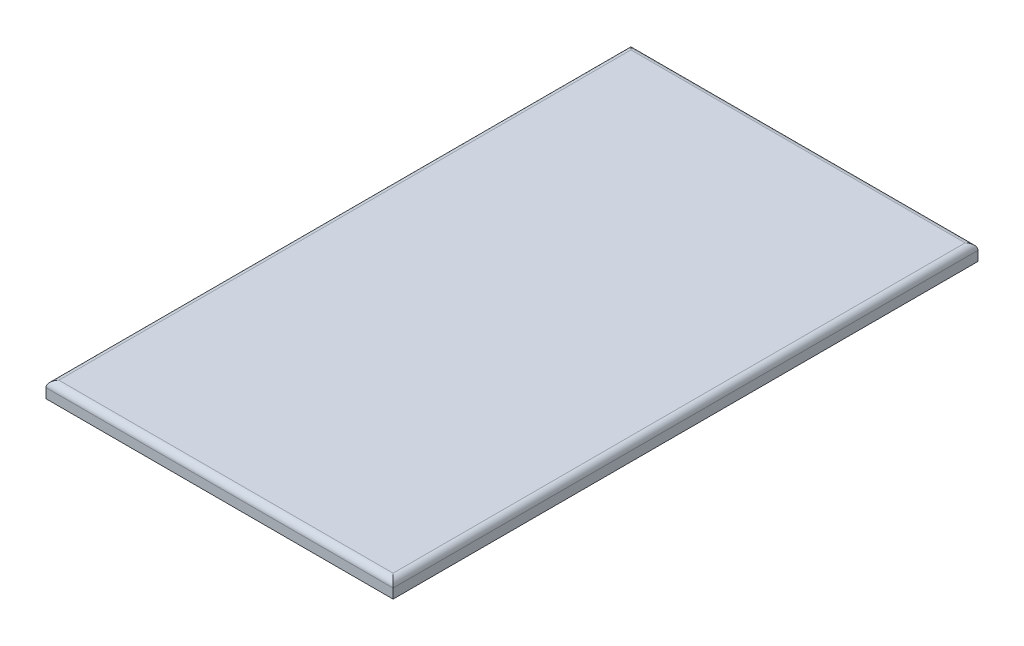
ISO-10303-21;
HEADER;
FILE_DESCRIPTION(('STEP AP214'),'2;1');
FILE_NAME('part.step','',(''),(''),'','','');
FILE_SCHEMA(('AUTOMOTIVE_DESIGN { 1 0 10303 214 1 1 1 1 }'));
ENDSEC;
DATA;
#1=APPLICATION_CONTEXT('core data for automotive mechanical design processes');
#2=APPLICATION_PROTOCOL_DEFINITION('international standard','automotive_design',2000,#1);
#3=PRODUCT_CONTEXT('',#1,'mechanical');
#4=PRODUCT('Part','Part','',(#3));
#5=PRODUCT_RELATED_PRODUCT_CATEGORY('part','',(#4));
#6=PRODUCT_DEFINITION_FORMATION('','',#4);
#7=PRODUCT_DEFINITION_CONTEXT('part definition',#1,'design');
#8=PRODUCT_DEFINITION('design','',#6,#7);
#9=PRODUCT_DEFINITION_SHAPE('','',#8);
#10=(LENGTH_UNIT() NAMED_UNIT(*) SI_UNIT(.MILLI.,.METRE.));
#11=(NAMED_UNIT(*) PLANE_ANGLE_UNIT() SI_UNIT($,.RADIAN.));
#12=(NAMED_UNIT(*) SI_UNIT($,.STERADIAN.) SOLID_ANGLE_UNIT());
#13=UNCERTAINTY_MEASURE_WITH_UNIT(LENGTH_MEASURE(1.E-05),#10,'distance_accuracy_value','');
#14=(GEOMETRIC_REPRESENTATION_CONTEXT(3) GLOBAL_UNCERTAINTY_ASSIGNED_CONTEXT((#13)) GLOBAL_UNIT_ASSIGNED_CONTEXT((#10,
#11,#12)) REPRESENTATION_CONTEXT('',''));
#15=CARTESIAN_POINT('',(0.,0.,0.));
#16=DIRECTION('',(0.,0.,1.));
#17=DIRECTION('',(1.,0.,0.));
#18=AXIS2_PLACEMENT_3D('',#15,#16,#17);
#19=CARTESIAN_POINT('',(27.,2.5,-45.5));
#20=DIRECTION('',(-1.,0.,0.));
#21=DIRECTION('',(0.,0.,1.));
#22=AXIS2_PLACEMENT_3D('',#19,#20,#21);
#23=PLANE('',#22);
#24=DIRECTION('',(0.,-1.,0.));
#25=VECTOR('',#24,1.);
#26=CARTESIAN_POINT('',(27.,2.5,-45.5));
#27=LINE('',#26,#25);
#28=CARTESIAN_POINT('',(27.,1.5,-45.5));
#29=VERTEX_POINT('',#28);
#30=CARTESIAN_POINT('',(27.,0.,-45.5));
#31=VERTEX_POINT('',#30);
#32=EDGE_CURVE('E87',#29,#31,#27,.T.);
#33=ORIENTED_EDGE('',*,*,#32,.F.);
#34=DIRECTION('',(0.,0.,-1.));
#35=VECTOR('',#34,1.);
#36=CARTESIAN_POINT('',(27.,1.5,45.5));
#37=LINE('',#36,#35);
#38=CARTESIAN_POINT('',(27.,1.5,45.5));
#39=VERTEX_POINT('',#38);
#40=EDGE_CURVE('E11',#29,#39,#37,.F.);
#41=ORIENTED_EDGE('',*,*,#40,.T.);
#42=DIRECTION('',(0.,-1.,0.));
#43=VECTOR('',#42,1.);
#44=CARTESIAN_POINT('',(27.,2.5,45.5));
#45=LINE('',#44,#43);
#46=CARTESIAN_POINT('',(27.,0.,45.5));
#47=VERTEX_POINT('',#46);
#48=EDGE_CURVE('E107',#39,#47,#45,.T.);
#49=ORIENTED_EDGE('',*,*,#48,.T.);
#50=DIRECTION('',(0.,0.,-1.));
#51=VECTOR('',#50,1.);
#52=CARTESIAN_POINT('',(27.,0.,-45.5));
#53=LINE('',#52,#51);
#54=EDGE_CURVE('E102',#47,#31,#53,.T.);
#55=ORIENTED_EDGE('',*,*,#54,.T.);
#56=EDGE_LOOP('',(#33,#41,#49,#55));
#57=FACE_BOUND('',#56,.T.);
#58=ADVANCED_FACE('F35',(#57),#23,.F.);
#59=CARTESIAN_POINT('',(-27.,2.5,-45.5));
#60=DIRECTION('',(0.,0.,1.));
#61=DIRECTION('',(1.,0.,0.));
#62=AXIS2_PLACEMENT_3D('',#59,#60,#61);
#63=PLANE('',#62);
#64=DIRECTION('',(0.,-1.,0.));
#65=VECTOR('',#64,1.);
#66=CARTESIAN_POINT('',(-27.,2.5,-45.5));
#67=LINE('',#66,#65);
#68=CARTESIAN_POINT('',(-27.,1.5,-45.5));
#69=VERTEX_POINT('',#68);
#70=CARTESIAN_POINT('',(-27.,0.,-45.5));
#71=VERTEX_POINT('',#70);
#72=EDGE_CURVE('E96',#69,#71,#67,.T.);
#73=ORIENTED_EDGE('',*,*,#72,.F.);
#74=DIRECTION('',(-1.,0.,0.));
#75=VECTOR('',#74,1.);
#76=CARTESIAN_POINT('',(27.,1.5,-45.5));
#77=LINE('',#76,#75);
#78=EDGE_CURVE('E44',#69,#29,#77,.F.);
#79=ORIENTED_EDGE('',*,*,#78,.T.);
#80=ORIENTED_EDGE('',*,*,#32,.T.);
#81=DIRECTION('',(-1.,0.,0.));
#82=VECTOR('',#81,1.);
#83=CARTESIAN_POINT('',(-27.,0.,-45.5));
#84=LINE('',#83,#82);
#85=EDGE_CURVE('E90',#31,#71,#84,.T.);
#86=ORIENTED_EDGE('',*,*,#85,.T.);
#87=EDGE_LOOP('',(#73,#79,#80,#86));
#88=FACE_BOUND('',#87,.T.);
#89=ADVANCED_FACE('F89',(#88),#63,.F.);
#90=CARTESIAN_POINT('',(-27.,2.5,-45.5));
#91=DIRECTION('',(1.,0.,0.));
#92=DIRECTION('',(0.,0.,-1.));
#93=AXIS2_PLACEMENT_3D('',#90,#91,#92);
#94=PLANE('',#93);
#95=DIRECTION('',(0.,-1.,0.));
#96=VECTOR('',#95,1.);
#97=CARTESIAN_POINT('',(-27.,2.5,45.5));
#98=LINE('',#97,#96);
#99=CARTESIAN_POINT('',(-27.,1.5,45.5));
#100=VERTEX_POINT('',#99);
#101=CARTESIAN_POINT('',(-27.,0.,45.5));
#102=VERTEX_POINT('',#101);
#103=EDGE_CURVE('E117',#100,#102,#98,.T.);
#104=ORIENTED_EDGE('',*,*,#103,.F.);
#105=DIRECTION('',(0.,0.,1.));
#106=VECTOR('',#105,1.);
#107=CARTESIAN_POINT('',(-27.,1.5,-45.5));
#108=LINE('',#107,#106);
#109=EDGE_CURVE('E59',#100,#69,#108,.F.);
#110=ORIENTED_EDGE('',*,*,#109,.T.);
#111=ORIENTED_EDGE('',*,*,#72,.T.);
#112=DIRECTION('',(0.,0.,1.));
#113=VECTOR('',#112,1.);
#114=CARTESIAN_POINT('',(-27.,0.,-45.5));
#115=LINE('',#114,#113);
#116=EDGE_CURVE('E104',#71,#102,#115,.T.);
#117=ORIENTED_EDGE('',*,*,#116,.T.);
#118=EDGE_LOOP('',(#104,#110,#111,#117));
#119=FACE_BOUND('',#118,.T.);
#120=ADVANCED_FACE('F155',(#119),#94,.F.);
#121=CARTESIAN_POINT('',(-27.,2.5,45.5));
#122=DIRECTION('',(0.,0.,-1.));
#123=DIRECTION('',(-1.,0.,0.));
#124=AXIS2_PLACEMENT_3D('',#121,#122,#123);
#125=PLANE('',#124);
#126=ORIENTED_EDGE('',*,*,#48,.F.);
#127=DIRECTION('',(1.,0.,0.));
#128=VECTOR('',#127,1.);
#129=CARTESIAN_POINT('',(-27.,1.5,45.5));
#130=LINE('',#129,#128);
#131=EDGE_CURVE('E128',#39,#100,#130,.F.);
#132=ORIENTED_EDGE('',*,*,#131,.T.);
#133=ORIENTED_EDGE('',*,*,#103,.T.);
#134=DIRECTION('',(1.,0.,0.));
#135=VECTOR('',#134,1.);
#136=CARTESIAN_POINT('',(-27.,0.,45.5));
#137=LINE('',#136,#135);
#138=EDGE_CURVE('E114',#102,#47,#137,.T.);
#139=ORIENTED_EDGE('',*,*,#138,.T.);
#140=EDGE_LOOP('',(#126,#132,#133,#139));
#141=FACE_BOUND('',#140,.T.);
#142=ADVANCED_FACE('F154',(#141),#125,.F.);
#143=CARTESIAN_POINT('',(0.,2.5,0.));
#144=DIRECTION('',(0.,1.,0.));
#145=DIRECTION('',(0.,0.,1.));
#146=AXIS2_PLACEMENT_3D('',#143,#144,#145);
#147=PLANE('',#146);
#148=DIRECTION('',(0.,0.,1.));
#149=VECTOR('',#148,1.);
#150=CARTESIAN_POINT('',(-26.,2.5,45.5));
#151=LINE('',#150,#149);
#152=CARTESIAN_POINT('',(-26.,2.5,-44.5));
#153=VERTEX_POINT('',#152);
#154=CARTESIAN_POINT('',(-26.,2.5,44.5));
#155=VERTEX_POINT('',#154);
#156=EDGE_CURVE('E123',#153,#155,#151,.T.);
#157=ORIENTED_EDGE('',*,*,#156,.T.);
#158=DIRECTION('',(1.,0.,0.));
#159=VECTOR('',#158,1.);
#160=CARTESIAN_POINT('',(27.,2.5,44.5));
#161=LINE('',#160,#159);
#162=CARTESIAN_POINT('',(26.,2.5,44.5));
#163=VERTEX_POINT('',#162);
#164=EDGE_CURVE('E125',#155,#163,#161,.T.);
#165=ORIENTED_EDGE('',*,*,#164,.T.);
#166=DIRECTION('',(0.,0.,-1.));
#167=VECTOR('',#166,1.);
#168=CARTESIAN_POINT('',(26.,2.5,-45.5));
#169=LINE('',#168,#167);
#170=CARTESIAN_POINT('',(26.,2.5,-44.5));
#171=VERTEX_POINT('',#170);
#172=EDGE_CURVE('E95',#163,#171,#169,.T.);
#173=ORIENTED_EDGE('',*,*,#172,.T.);
#174=DIRECTION('',(-1.,0.,0.));
#175=VECTOR('',#174,1.);
#176=CARTESIAN_POINT('',(-27.,2.5,-44.5));
#177=LINE('',#176,#175);
#178=EDGE_CURVE('E121',#171,#153,#177,.T.);
#179=ORIENTED_EDGE('',*,*,#178,.T.);
#180=EDGE_LOOP('',(#157,#165,#173,#179));
#181=FACE_BOUND('',#180,.T.);
#182=ADVANCED_FACE('F147',(#181),#147,.T.);
#183=CARTESIAN_POINT('',(0.,0.,0.));
#184=DIRECTION('',(0.,1.,0.));
#185=DIRECTION('',(0.,0.,1.));
#186=AXIS2_PLACEMENT_3D('',#183,#184,#185);
#187=PLANE('',#186);
#188=ORIENTED_EDGE('',*,*,#54,.F.);
#189=ORIENTED_EDGE('',*,*,#138,.F.);
#190=ORIENTED_EDGE('',*,*,#116,.F.);
#191=ORIENTED_EDGE('',*,*,#85,.F.);
#192=EDGE_LOOP('',(#188,#189,#190,#191));
#193=FACE_BOUND('',#192,.T.);
#194=ADVANCED_FACE('F100',(#193),#187,.F.);
#195=CARTESIAN_POINT('',(0.,1.5,-44.5));
#196=DIRECTION('',(1.,0.,0.));
#197=DIRECTION('',(0.,0.,-1.));
#198=AXIS2_PLACEMENT_3D('',#195,#196,#197);
#199=CYLINDRICAL_SURFACE('',#198,1.);
#200=CARTESIAN_POINT('',(26.,1.5,-44.5));
#201=DIRECTION('',(0.707106781186548,0.,0.707106781186547));
#202=DIRECTION('',(-0.707106781186547,0.,0.707106781186548));
#203=AXIS2_PLACEMENT_3D('',#200,#201,#202);
#204=ELLIPSE('',#203,1.41421356237309,1.);
#205=EDGE_CURVE('E111',#29,#171,#204,.T.);
#206=ORIENTED_EDGE('',*,*,#205,.F.);
#207=ORIENTED_EDGE('',*,*,#78,.F.);
#208=CARTESIAN_POINT('',(-26.,1.5,-44.5));
#209=DIRECTION('',(0.707106781186547,0.,-0.707106781186548));
#210=DIRECTION('',(0.707106781186548,0.,0.707106781186547));
#211=AXIS2_PLACEMENT_3D('',#208,#209,#210);
#212=ELLIPSE('',#211,1.4142135623731,1.);
#213=EDGE_CURVE('E39',#153,#69,#212,.F.);
#214=ORIENTED_EDGE('',*,*,#213,.F.);
#215=ORIENTED_EDGE('',*,*,#178,.F.);
#216=EDGE_LOOP('',(#206,#207,#214,#215));
#217=FACE_BOUND('',#216,.T.);
#218=ADVANCED_FACE('F37',(#217),#199,.T.);
#219=CARTESIAN_POINT('',(-26.,1.5,0.));
#220=DIRECTION('',(0.,0.,-1.));
#221=DIRECTION('',(-1.,0.,0.));
#222=AXIS2_PLACEMENT_3D('',#219,#220,#221);
#223=CYLINDRICAL_SURFACE('',#222,1.);
#224=ORIENTED_EDGE('',*,*,#213,.T.);
#225=ORIENTED_EDGE('',*,*,#109,.F.);
#226=CARTESIAN_POINT('',(-26.,1.5,44.5));
#227=DIRECTION('',(-0.707106781186548,0.,-0.707106781186547));
#228=DIRECTION('',(0.707106781186547,0.,-0.707106781186548));
#229=AXIS2_PLACEMENT_3D('',#226,#227,#228);
#230=ELLIPSE('',#229,1.41421356237309,1.);
#231=EDGE_CURVE('E135',#155,#100,#230,.F.);
#232=ORIENTED_EDGE('',*,*,#231,.F.);
#233=ORIENTED_EDGE('',*,*,#156,.F.);
#234=EDGE_LOOP('',(#224,#225,#232,#233));
#235=FACE_BOUND('',#234,.T.);
#236=ADVANCED_FACE('F173',(#235),#223,.T.);
#237=CARTESIAN_POINT('',(26.,1.5,0.));
#238=DIRECTION('',(0.,0.,1.));
#239=DIRECTION('',(1.,0.,0.));
#240=AXIS2_PLACEMENT_3D('',#237,#238,#239);
#241=CYLINDRICAL_SURFACE('',#240,1.);
#242=ORIENTED_EDGE('',*,*,#205,.T.);
#243=ORIENTED_EDGE('',*,*,#172,.F.);
#244=CARTESIAN_POINT('',(26.,1.5,44.5));
#245=DIRECTION('',(-0.707106781186547,0.,0.707106781186548));
#246=DIRECTION('',(0.707106781186548,0.,0.707106781186547));
#247=AXIS2_PLACEMENT_3D('',#244,#245,#246);
#248=ELLIPSE('',#247,1.4142135623731,1.);
#249=EDGE_CURVE('E133',#39,#163,#248,.T.);
#250=ORIENTED_EDGE('',*,*,#249,.F.);
#251=ORIENTED_EDGE('',*,*,#40,.F.);
#252=EDGE_LOOP('',(#242,#243,#250,#251));
#253=FACE_BOUND('',#252,.T.);
#254=ADVANCED_FACE('F140',(#253),#241,.T.);
#255=CARTESIAN_POINT('',(0.,1.5,44.5));
#256=DIRECTION('',(-1.,0.,0.));
#257=DIRECTION('',(0.,0.,1.));
#258=AXIS2_PLACEMENT_3D('',#255,#256,#257);
#259=CYLINDRICAL_SURFACE('',#258,1.);
#260=ORIENTED_EDGE('',*,*,#231,.T.);
#261=ORIENTED_EDGE('',*,*,#131,.F.);
#262=ORIENTED_EDGE('',*,*,#249,.T.);
#263=ORIENTED_EDGE('',*,*,#164,.F.);
#264=EDGE_LOOP('',(#260,#261,#262,#263));
#265=FACE_BOUND('',#264,.T.);
#266=ADVANCED_FACE('F151',(#265),#259,.T.);
#267=CLOSED_SHELL('',(#58,#89,#120,#142,#182,#194,#218,#236,#254,#266));
#268=MANIFOLD_SOLID_BREP('B2',#267);
#269=ADVANCED_BREP_SHAPE_REPRESENTATION('',(#18,#268),#14);
#270=SHAPE_DEFINITION_REPRESENTATION(#9,#269);
ENDSEC;
END-ISO-10303-21;
